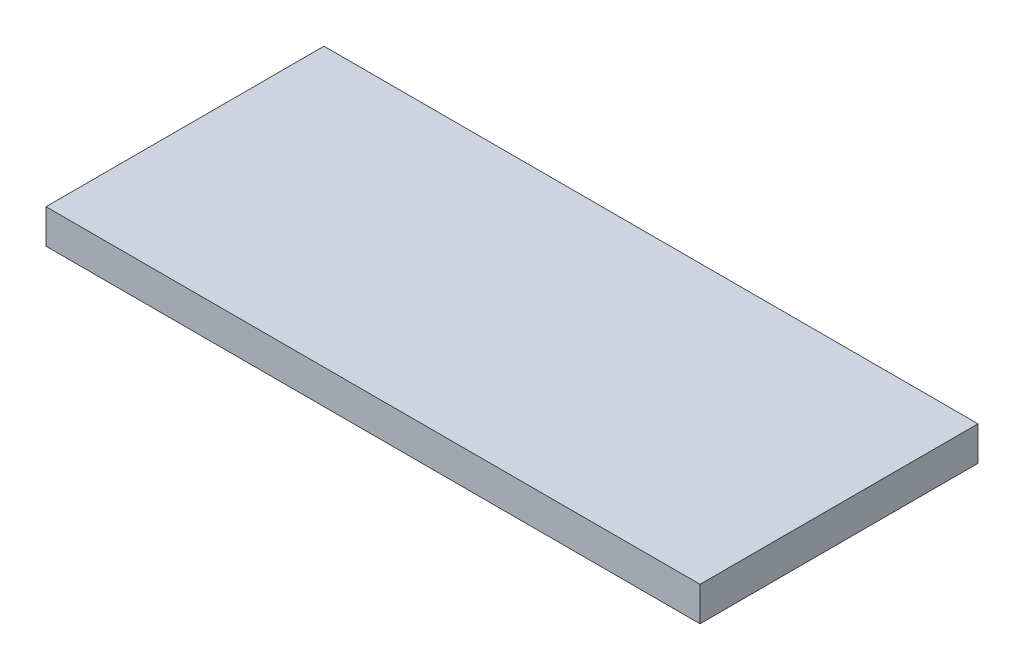
ISO-10303-21;
HEADER;
FILE_DESCRIPTION(('STEP AP214'),'2;1');
FILE_NAME('part.step','',(''),(''),'','','');
FILE_SCHEMA(('AUTOMOTIVE_DESIGN { 1 0 10303 214 1 1 1 1 }'));
ENDSEC;
DATA;
#1=APPLICATION_CONTEXT('core data for automotive mechanical design processes');
#2=APPLICATION_PROTOCOL_DEFINITION('international standard','automotive_design',2000,#1);
#3=PRODUCT_CONTEXT('',#1,'mechanical');
#4=PRODUCT('Part','Part','',(#3));
#5=PRODUCT_RELATED_PRODUCT_CATEGORY('part','',(#4));
#6=PRODUCT_DEFINITION_FORMATION('','',#4);
#7=PRODUCT_DEFINITION_CONTEXT('part definition',#1,'design');
#8=PRODUCT_DEFINITION('design','',#6,#7);
#9=PRODUCT_DEFINITION_SHAPE('','',#8);
#10=(LENGTH_UNIT() NAMED_UNIT(*) SI_UNIT(.MILLI.,.METRE.));
#11=(NAMED_UNIT(*) PLANE_ANGLE_UNIT() SI_UNIT($,.RADIAN.));
#12=(NAMED_UNIT(*) SI_UNIT($,.STERADIAN.) SOLID_ANGLE_UNIT());
#13=UNCERTAINTY_MEASURE_WITH_UNIT(LENGTH_MEASURE(1.E-05),#10,'distance_accuracy_value','');
#14=(GEOMETRIC_REPRESENTATION_CONTEXT(3) GLOBAL_UNCERTAINTY_ASSIGNED_CONTEXT((#13)) GLOBAL_UNIT_ASSIGNED_CONTEXT((#10,
#11,#12)) REPRESENTATION_CONTEXT('',''));
#15=CARTESIAN_POINT('',(0.,0.,0.));
#16=DIRECTION('',(0.,0.,1.));
#17=DIRECTION('',(1.,0.,0.));
#18=AXIS2_PLACEMENT_3D('',#15,#16,#17);
#19=CARTESIAN_POINT('',(0.,3.125,0.));
#20=DIRECTION('',(1.,0.,0.));
#21=DIRECTION('',(0.,0.,-1.));
#22=AXIS2_PLACEMENT_3D('',#19,#20,#21);
#23=PLANE('',#22);
#24=DIRECTION('',(0.,0.,1.));
#25=VECTOR('',#24,1.);
#26=CARTESIAN_POINT('',(0.,0.,0.));
#27=LINE('',#26,#25);
#28=CARTESIAN_POINT('',(0.,0.,-25.4));
#29=VERTEX_POINT('',#28);
#30=CARTESIAN_POINT('',(0.,0.,0.));
#31=VERTEX_POINT('',#30);
#32=EDGE_CURVE('E115',#29,#31,#27,.T.);
#33=ORIENTED_EDGE('',*,*,#32,.T.);
#34=DIRECTION('',(0.,-1.,0.));
#35=VECTOR('',#34,1.);
#36=CARTESIAN_POINT('',(0.,3.125,0.));
#37=LINE('',#36,#35);
#38=CARTESIAN_POINT('',(0.,3.125,0.));
#39=VERTEX_POINT('',#38);
#40=EDGE_CURVE('E11',#39,#31,#37,.T.);
#41=ORIENTED_EDGE('',*,*,#40,.F.);
#42=DIRECTION('',(0.,0.,1.));
#43=VECTOR('',#42,1.);
#44=CARTESIAN_POINT('',(0.,3.125,0.));
#45=LINE('',#44,#43);
#46=CARTESIAN_POINT('',(0.,3.125,-25.4));
#47=VERTEX_POINT('',#46);
#48=EDGE_CURVE('E99',#47,#39,#45,.T.);
#49=ORIENTED_EDGE('',*,*,#48,.F.);
#50=DIRECTION('',(0.,-1.,0.));
#51=VECTOR('',#50,1.);
#52=CARTESIAN_POINT('',(0.,3.125,-25.4));
#53=LINE('',#52,#51);
#54=EDGE_CURVE('E111',#47,#29,#53,.T.);
#55=ORIENTED_EDGE('',*,*,#54,.T.);
#56=EDGE_LOOP('',(#33,#41,#49,#55));
#57=FACE_BOUND('',#56,.T.);
#58=ADVANCED_FACE('F47',(#57),#23,.F.);
#59=CARTESIAN_POINT('',(0.,3.125,0.));
#60=DIRECTION('',(0.,0.,-1.));
#61=DIRECTION('',(-1.,0.,0.));
#62=AXIS2_PLACEMENT_3D('',#59,#60,#61);
#63=PLANE('',#62);
#64=DIRECTION('',(1.,0.,0.));
#65=VECTOR('',#64,1.);
#66=CARTESIAN_POINT('',(0.,0.,0.));
#67=LINE('',#66,#65);
#68=CARTESIAN_POINT('',(59.76,0.,0.));
#69=VERTEX_POINT('',#68);
#70=EDGE_CURVE('E104',#31,#69,#67,.T.);
#71=ORIENTED_EDGE('',*,*,#70,.T.);
#72=DIRECTION('',(0.,-1.,0.));
#73=VECTOR('',#72,1.);
#74=CARTESIAN_POINT('',(59.76,3.125,0.));
#75=LINE('',#74,#73);
#76=CARTESIAN_POINT('',(59.76,3.125,0.));
#77=VERTEX_POINT('',#76);
#78=EDGE_CURVE('E56',#77,#69,#75,.T.);
#79=ORIENTED_EDGE('',*,*,#78,.F.);
#80=DIRECTION('',(1.,0.,0.));
#81=VECTOR('',#80,1.);
#82=CARTESIAN_POINT('',(0.,3.125,0.));
#83=LINE('',#82,#81);
#84=EDGE_CURVE('E94',#39,#77,#83,.T.);
#85=ORIENTED_EDGE('',*,*,#84,.F.);
#86=ORIENTED_EDGE('',*,*,#40,.T.);
#87=EDGE_LOOP('',(#71,#79,#85,#86));
#88=FACE_BOUND('',#87,.T.);
#89=ADVANCED_FACE('F103',(#88),#63,.F.);
#90=CARTESIAN_POINT('',(59.76,3.125,0.));
#91=DIRECTION('',(-1.,0.,0.));
#92=DIRECTION('',(0.,0.,1.));
#93=AXIS2_PLACEMENT_3D('',#90,#91,#92);
#94=PLANE('',#93);
#95=DIRECTION('',(0.,0.,-1.));
#96=VECTOR('',#95,1.);
#97=CARTESIAN_POINT('',(59.76,0.,0.));
#98=LINE('',#97,#96);
#99=CARTESIAN_POINT('',(59.76,0.,-25.4));
#100=VERTEX_POINT('',#99);
#101=EDGE_CURVE('E81',#69,#100,#98,.T.);
#102=ORIENTED_EDGE('',*,*,#101,.T.);
#103=DIRECTION('',(0.,-1.,0.));
#104=VECTOR('',#103,1.);
#105=CARTESIAN_POINT('',(59.76,3.125,-25.4));
#106=LINE('',#105,#104);
#107=CARTESIAN_POINT('',(59.76,3.125,-25.4));
#108=VERTEX_POINT('',#107);
#109=EDGE_CURVE('E106',#108,#100,#106,.T.);
#110=ORIENTED_EDGE('',*,*,#109,.F.);
#111=DIRECTION('',(0.,0.,-1.));
#112=VECTOR('',#111,1.);
#113=CARTESIAN_POINT('',(59.76,3.125,0.));
#114=LINE('',#113,#112);
#115=EDGE_CURVE('E97',#77,#108,#114,.T.);
#116=ORIENTED_EDGE('',*,*,#115,.F.);
#117=ORIENTED_EDGE('',*,*,#78,.T.);
#118=EDGE_LOOP('',(#102,#110,#116,#117));
#119=FACE_BOUND('',#118,.T.);
#120=ADVANCED_FACE('F107',(#119),#94,.F.);
#121=CARTESIAN_POINT('',(0.,3.125,-25.4));
#122=DIRECTION('',(0.,0.,1.));
#123=DIRECTION('',(1.,0.,0.));
#124=AXIS2_PLACEMENT_3D('',#121,#122,#123);
#125=PLANE('',#124);
#126=DIRECTION('',(-1.,0.,0.));
#127=VECTOR('',#126,1.);
#128=CARTESIAN_POINT('',(0.,0.,-25.4));
#129=LINE('',#128,#127);
#130=EDGE_CURVE('E87',#100,#29,#129,.T.);
#131=ORIENTED_EDGE('',*,*,#130,.T.);
#132=ORIENTED_EDGE('',*,*,#54,.F.);
#133=DIRECTION('',(-1.,0.,0.));
#134=VECTOR('',#133,1.);
#135=CARTESIAN_POINT('',(0.,3.125,-25.4));
#136=LINE('',#135,#134);
#137=EDGE_CURVE('E64',#108,#47,#136,.T.);
#138=ORIENTED_EDGE('',*,*,#137,.F.);
#139=ORIENTED_EDGE('',*,*,#109,.T.);
#140=EDGE_LOOP('',(#131,#132,#138,#139));
#141=FACE_BOUND('',#140,.T.);
#142=ADVANCED_FACE('F128',(#141),#125,.F.);
#143=CARTESIAN_POINT('',(0.,3.125,0.));
#144=DIRECTION('',(0.,-1.,0.));
#145=DIRECTION('',(0.,0.,-1.));
#146=AXIS2_PLACEMENT_3D('',#143,#144,#145);
#147=PLANE('',#146);
#148=ORIENTED_EDGE('',*,*,#48,.T.);
#149=ORIENTED_EDGE('',*,*,#84,.T.);
#150=ORIENTED_EDGE('',*,*,#115,.T.);
#151=ORIENTED_EDGE('',*,*,#137,.T.);
#152=EDGE_LOOP('',(#148,#149,#150,#151));
#153=FACE_BOUND('',#152,.T.);
#154=ADVANCED_FACE('F95',(#153),#147,.F.);
#155=CARTESIAN_POINT('',(0.,0.,0.));
#156=DIRECTION('',(0.,-1.,0.));
#157=DIRECTION('',(0.,0.,-1.));
#158=AXIS2_PLACEMENT_3D('',#155,#156,#157);
#159=PLANE('',#158);
#160=ORIENTED_EDGE('',*,*,#32,.F.);
#161=ORIENTED_EDGE('',*,*,#130,.F.);
#162=ORIENTED_EDGE('',*,*,#101,.F.);
#163=ORIENTED_EDGE('',*,*,#70,.F.);
#164=EDGE_LOOP('',(#160,#161,#162,#163));
#165=FACE_BOUND('',#164,.T.);
#166=ADVANCED_FACE('F131',(#165),#159,.T.);
#167=CLOSED_SHELL('',(#58,#89,#120,#142,#154,#166));
#168=MANIFOLD_SOLID_BREP('B2',#167);
#169=ADVANCED_BREP_SHAPE_REPRESENTATION('',(#18,#168),#14);
#170=SHAPE_DEFINITION_REPRESENTATION(#9,#169);
ENDSEC;
END-ISO-10303-21;
